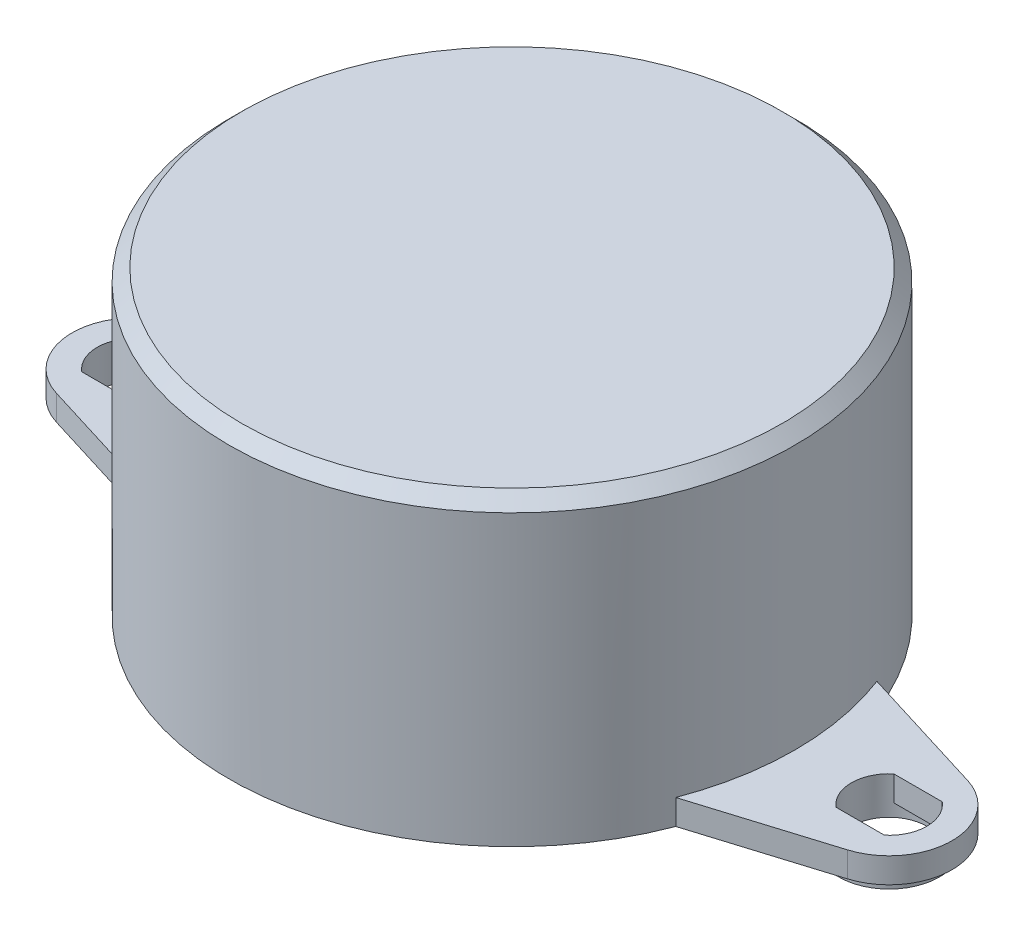
ISO-10303-21;
HEADER;
FILE_DESCRIPTION(('STEP AP214'),'2;1');
FILE_NAME('part.step','',(''),(''),'','','');
FILE_SCHEMA(('AUTOMOTIVE_DESIGN { 1 0 10303 214 1 1 1 1 }'));
ENDSEC;
DATA;
#1=APPLICATION_CONTEXT('core data for automotive mechanical design processes');
#2=APPLICATION_PROTOCOL_DEFINITION('international standard','automotive_design',2000,#1);
#3=PRODUCT_CONTEXT('',#1,'mechanical');
#4=PRODUCT('Part','Part','',(#3));
#5=PRODUCT_RELATED_PRODUCT_CATEGORY('part','',(#4));
#6=PRODUCT_DEFINITION_FORMATION('','',#4);
#7=PRODUCT_DEFINITION_CONTEXT('part definition',#1,'design');
#8=PRODUCT_DEFINITION('design','',#6,#7);
#9=PRODUCT_DEFINITION_SHAPE('','',#8);
#10=(LENGTH_UNIT() NAMED_UNIT(*) SI_UNIT(.MILLI.,.METRE.));
#11=(NAMED_UNIT(*) PLANE_ANGLE_UNIT() SI_UNIT($,.RADIAN.));
#12=(NAMED_UNIT(*) SI_UNIT($,.STERADIAN.) SOLID_ANGLE_UNIT());
#13=UNCERTAINTY_MEASURE_WITH_UNIT(LENGTH_MEASURE(1.E-05),#10,'distance_accuracy_value','');
#14=(GEOMETRIC_REPRESENTATION_CONTEXT(3) GLOBAL_UNCERTAINTY_ASSIGNED_CONTEXT((#13)) GLOBAL_UNIT_ASSIGNED_CONTEXT((#10,
#11,#12)) REPRESENTATION_CONTEXT('',''));
#15=CARTESIAN_POINT('',(0.,0.,0.));
#16=DIRECTION('',(0.,0.,1.));
#17=DIRECTION('',(1.,0.,0.));
#18=AXIS2_PLACEMENT_3D('',#15,#16,#17);
#19=CARTESIAN_POINT('',(0.,0.,0.));
#20=DIRECTION('',(0.,1.,0.));
#21=DIRECTION('',(0.,0.,1.));
#22=AXIS2_PLACEMENT_3D('',#19,#20,#21);
#23=PLANE('',#22);
#24=DIRECTION('',(1.,0.,0.));
#25=VECTOR('',#24,1.);
#26=CARTESIAN_POINT('',(-14.0369319857871,0.,-1.15));
#27=LINE('',#26,#25);
#28=CARTESIAN_POINT('',(-15.9630680142129,0.,-1.15));
#29=VERTEX_POINT('',#28);
#30=CARTESIAN_POINT('',(-14.0369319857871,0.,-1.15));
#31=VERTEX_POINT('',#30);
#32=EDGE_CURVE('E161',#29,#31,#27,.T.);
#33=ORIENTED_EDGE('',*,*,#32,.F.);
#34=CARTESIAN_POINT('',(-15.,0.,0.));
#35=DIRECTION('',(0.,-1.,0.));
#36=DIRECTION('',(0.,0.,-1.));
#37=AXIS2_PLACEMENT_3D('',#34,#35,#36);
#38=CIRCLE('',#37,1.50000000000001);
#39=EDGE_CURVE('E158',#29,#31,#38,.T.);
#40=ORIENTED_EDGE('',*,*,#39,.T.);
#41=EDGE_LOOP('',(#33,#40));
#42=FACE_BOUND('',#41,.T.);
#43=ADVANCED_FACE('F45',(#42),#23,.F.);
#44=DIRECTION('',(-1.,0.,0.));
#45=VECTOR('',#44,1.);
#46=CARTESIAN_POINT('',(-15.9630680142129,0.,1.15));
#47=LINE('',#46,#45);
#48=CARTESIAN_POINT('',(-14.0369319857871,0.,1.15));
#49=VERTEX_POINT('',#48);
#50=CARTESIAN_POINT('',(-15.9630680142129,0.,1.15));
#51=VERTEX_POINT('',#50);
#52=EDGE_CURVE('E184',#49,#51,#47,.T.);
#53=ORIENTED_EDGE('',*,*,#52,.F.);
#54=EDGE_CURVE('E165',#49,#51,#38,.T.);
#55=ORIENTED_EDGE('',*,*,#54,.T.);
#56=EDGE_LOOP('',(#53,#55));
#57=FACE_BOUND('',#56,.T.);
#58=ADVANCED_FACE('F422',(#57),#23,.F.);
#59=DIRECTION('',(-1.,0.,0.));
#60=VECTOR('',#59,1.);
#61=CARTESIAN_POINT('',(14.0369319857871,0.,1.15000000000001));
#62=LINE('',#61,#60);
#63=CARTESIAN_POINT('',(15.9630680142129,0.,1.15000000000001));
#64=VERTEX_POINT('',#63);
#65=CARTESIAN_POINT('',(14.0369319857871,0.,1.15));
#66=VERTEX_POINT('',#65);
#67=EDGE_CURVE('E193',#64,#66,#62,.T.);
#68=ORIENTED_EDGE('',*,*,#67,.F.);
#69=CARTESIAN_POINT('',(15.,0.,0.));
#70=DIRECTION('',(0.,-1.,0.));
#71=DIRECTION('',(0.,0.,-1.));
#72=AXIS2_PLACEMENT_3D('',#69,#70,#71);
#73=CIRCLE('',#72,1.50000000000001);
#74=EDGE_CURVE('E262',#64,#66,#73,.T.);
#75=ORIENTED_EDGE('',*,*,#74,.T.);
#76=EDGE_LOOP('',(#68,#75));
#77=FACE_BOUND('',#76,.T.);
#78=ADVANCED_FACE('F426',(#77),#23,.F.);
#79=DIRECTION('',(1.,0.,0.));
#80=VECTOR('',#79,1.);
#81=CARTESIAN_POINT('',(14.0369319857871,0.,-1.14999999999999));
#82=LINE('',#81,#80);
#83=CARTESIAN_POINT('',(14.0369319857871,0.,-1.15));
#84=VERTEX_POINT('',#83);
#85=CARTESIAN_POINT('',(15.9630680142129,0.,-1.15));
#86=VERTEX_POINT('',#85);
#87=EDGE_CURVE('E185',#84,#86,#82,.T.);
#88=ORIENTED_EDGE('',*,*,#87,.F.);
#89=EDGE_CURVE('E258',#84,#86,#73,.T.);
#90=ORIENTED_EDGE('',*,*,#89,.T.);
#91=EDGE_LOOP('',(#88,#90));
#92=FACE_BOUND('',#91,.T.);
#93=ADVANCED_FACE('F393',(#92),#23,.F.);
#94=CARTESIAN_POINT('',(0.,12.,0.));
#95=DIRECTION('',(0.,-1.,0.));
#96=DIRECTION('',(0.,0.,-1.));
#97=AXIS2_PLACEMENT_3D('',#94,#95,#96);
#98=CYLINDRICAL_SURFACE('',#97,11.25);
#99=CARTESIAN_POINT('',(0.,11.5,0.));
#100=DIRECTION('',(0.,1.,0.));
#101=DIRECTION('',(0.,0.,1.));
#102=AXIS2_PLACEMENT_3D('',#99,#100,#101);
#103=CIRCLE('',#102,11.25);
#104=CARTESIAN_POINT('',(0.,11.5,11.25));
#105=VERTEX_POINT('',#104);
#106=EDGE_CURVE('E255',#105,#105,#103,.F.);
#107=ORIENTED_EDGE('',*,*,#106,.T.);
#108=EDGE_LOOP('',(#107));
#109=FACE_BOUND('',#108,.T.);
#110=CARTESIAN_POINT('',(0.,1.,0.));
#111=DIRECTION('',(0.,1.,0.));
#112=DIRECTION('',(0.,0.,-1.));
#113=AXIS2_PLACEMENT_3D('',#110,#111,#112);
#114=CIRCLE('',#113,11.25);
#115=CARTESIAN_POINT('',(10.5148704224065,1.,4.));
#116=VERTEX_POINT('',#115);
#117=CARTESIAN_POINT('',(10.5148704224065,1.,-4.));
#118=VERTEX_POINT('',#117);
#119=EDGE_CURVE('E66',#116,#118,#114,.T.);
#120=ORIENTED_EDGE('',*,*,#119,.T.);
#121=DIRECTION('',(0.,-1.,0.));
#122=VECTOR('',#121,1.);
#123=CARTESIAN_POINT('',(10.5148704224065,1.,-4.));
#124=LINE('',#123,#122);
#125=CARTESIAN_POINT('',(10.5148704224065,0.,-4.));
#126=VERTEX_POINT('',#125);
#127=EDGE_CURVE('E286',#118,#126,#124,.T.);
#128=ORIENTED_EDGE('',*,*,#127,.T.);
#129=CARTESIAN_POINT('',(0.,0.,0.));
#130=DIRECTION('',(0.,1.,0.));
#131=DIRECTION('',(0.,0.,1.));
#132=AXIS2_PLACEMENT_3D('',#129,#130,#131);
#133=CIRCLE('',#132,11.25);
#134=CARTESIAN_POINT('',(-10.5148704224065,0.,-4.));
#135=VERTEX_POINT('',#134);
#136=EDGE_CURVE('E238',#126,#135,#133,.T.);
#137=ORIENTED_EDGE('',*,*,#136,.T.);
#138=DIRECTION('',(0.,-1.,0.));
#139=VECTOR('',#138,1.);
#140=CARTESIAN_POINT('',(-10.5148704224065,1.,-4.));
#141=LINE('',#140,#139);
#142=CARTESIAN_POINT('',(-10.5148704224065,1.,-4.));
#143=VERTEX_POINT('',#142);
#144=EDGE_CURVE('E243',#143,#135,#141,.T.);
#145=ORIENTED_EDGE('',*,*,#144,.F.);
#146=CARTESIAN_POINT('',(0.,1.,0.));
#147=DIRECTION('',(0.,1.,0.));
#148=DIRECTION('',(0.,0.,-1.));
#149=AXIS2_PLACEMENT_3D('',#146,#147,#148);
#150=CIRCLE('',#149,11.25);
#151=CARTESIAN_POINT('',(-10.5148704224065,1.,4.));
#152=VERTEX_POINT('',#151);
#153=EDGE_CURVE('E217',#143,#152,#150,.T.);
#154=ORIENTED_EDGE('',*,*,#153,.T.);
#155=DIRECTION('',(0.,-1.,0.));
#156=VECTOR('',#155,1.);
#157=CARTESIAN_POINT('',(-10.5148704224065,1.,4.));
#158=LINE('',#157,#156);
#159=CARTESIAN_POINT('',(-10.5148704224065,0.,4.));
#160=VERTEX_POINT('',#159);
#161=EDGE_CURVE('E239',#152,#160,#158,.T.);
#162=ORIENTED_EDGE('',*,*,#161,.T.);
#163=CARTESIAN_POINT('',(10.5148704224065,0.,4.));
#164=VERTEX_POINT('',#163);
#165=EDGE_CURVE('E249',#160,#164,#133,.T.);
#166=ORIENTED_EDGE('',*,*,#165,.T.);
#167=DIRECTION('',(0.,-1.,0.));
#168=VECTOR('',#167,1.);
#169=CARTESIAN_POINT('',(10.5148704224065,1.,4.));
#170=LINE('',#169,#168);
#171=EDGE_CURVE('E62',#116,#164,#170,.T.);
#172=ORIENTED_EDGE('',*,*,#171,.F.);
#173=EDGE_LOOP('',(#120,#128,#137,#145,#154,#162,#166,#172));
#174=FACE_BOUND('',#173,.T.);
#175=ADVANCED_FACE('F399',(#109,#174),#98,.T.);
#176=CARTESIAN_POINT('',(0.,12.,0.));
#177=DIRECTION('',(0.,1.,0.));
#178=DIRECTION('',(0.,0.,1.));
#179=AXIS2_PLACEMENT_3D('',#176,#177,#178);
#180=PLANE('',#179);
#181=CARTESIAN_POINT('',(0.,12.,0.));
#182=DIRECTION('',(0.,1.,0.));
#183=DIRECTION('',(0.,0.,1.));
#184=AXIS2_PLACEMENT_3D('',#181,#182,#183);
#185=CIRCLE('',#184,10.75);
#186=CARTESIAN_POINT('',(0.,12.,10.75));
#187=VERTEX_POINT('',#186);
#188=EDGE_CURVE('E252',#187,#187,#185,.T.);
#189=ORIENTED_EDGE('',*,*,#188,.T.);
#190=EDGE_LOOP('',(#189));
#191=FACE_BOUND('',#190,.T.);
#192=ADVANCED_FACE('F391',(#191),#180,.T.);
#193=CARTESIAN_POINT('',(-15.,0.,0.));
#194=DIRECTION('',(0.,1.,0.));
#195=DIRECTION('',(0.,0.,1.));
#196=AXIS2_PLACEMENT_3D('',#193,#194,#195);
#197=CIRCLE('',#196,2.00000000000001);
#198=CARTESIAN_POINT('',(-15.,0.,2.));
#199=VERTEX_POINT('',#198);
#200=EDGE_CURVE('E11',#199,#199,#197,.F.);
#201=ORIENTED_EDGE('',*,*,#200,.F.);
#202=EDGE_LOOP('',(#201));
#203=FACE_BOUND('',#202,.T.);
#204=CARTESIAN_POINT('',(15.,0.,0.));
#205=DIRECTION('',(0.,-1.,0.));
#206=DIRECTION('',(0.,0.,-1.));
#207=AXIS2_PLACEMENT_3D('',#204,#205,#206);
#208=CIRCLE('',#207,2.00000000000001);
#209=CARTESIAN_POINT('',(15.,0.,-2.00000000000001));
#210=VERTEX_POINT('',#209);
#211=EDGE_CURVE('E55',#210,#210,#208,.T.);
#212=ORIENTED_EDGE('',*,*,#211,.F.);
#213=EDGE_LOOP('',(#212));
#214=FACE_BOUND('',#213,.T.);
#215=ORIENTED_EDGE('',*,*,#165,.F.);
#216=DIRECTION('',(-0.95555791445854,0.,-0.294803446580338));
#217=VECTOR('',#216,1.);
#218=CARTESIAN_POINT('',(-15.7370086164509,0.,2.38889478614653));
#219=LINE('',#218,#217);
#220=CARTESIAN_POINT('',(-15.7370086164509,0.,2.38889478614653));
#221=VERTEX_POINT('',#220);
#222=EDGE_CURVE('E213',#160,#221,#219,.T.);
#223=ORIENTED_EDGE('',*,*,#222,.T.);
#224=CARTESIAN_POINT('',(-15.,0.,0.));
#225=DIRECTION('',(0.,-1.,0.));
#226=DIRECTION('',(0.,0.,-1.));
#227=AXIS2_PLACEMENT_3D('',#224,#225,#226);
#228=CIRCLE('',#227,2.50000000000019);
#229=CARTESIAN_POINT('',(-15.7370086164509,0.,-2.38889478614653));
#230=VERTEX_POINT('',#229);
#231=EDGE_CURVE('E202',#221,#230,#228,.T.);
#232=ORIENTED_EDGE('',*,*,#231,.T.);
#233=DIRECTION('',(0.95555791445854,0.,-0.294803446580338));
#234=VECTOR('',#233,1.);
#235=CARTESIAN_POINT('',(-15.7370086164509,0.,-2.38889478614653));
#236=LINE('',#235,#234);
#237=EDGE_CURVE('E228',#230,#135,#236,.T.);
#238=ORIENTED_EDGE('',*,*,#237,.T.);
#239=ORIENTED_EDGE('',*,*,#136,.F.);
#240=DIRECTION('',(0.95555791445854,0.,0.294803446580338));
#241=VECTOR('',#240,1.);
#242=CARTESIAN_POINT('',(15.7370086164509,0.,-2.38889478614653));
#243=LINE('',#242,#241);
#244=CARTESIAN_POINT('',(15.7370086164509,0.,-2.38889478614653));
#245=VERTEX_POINT('',#244);
#246=EDGE_CURVE('E291',#126,#245,#243,.T.);
#247=ORIENTED_EDGE('',*,*,#246,.T.);
#248=CARTESIAN_POINT('',(15.,0.,0.));
#249=DIRECTION('',(0.,-1.,0.));
#250=DIRECTION('',(0.,0.,-1.));
#251=AXIS2_PLACEMENT_3D('',#248,#249,#250);
#252=CIRCLE('',#251,2.50000000000019);
#253=CARTESIAN_POINT('',(15.7370086164509,0.,2.38889478614653));
#254=VERTEX_POINT('',#253);
#255=EDGE_CURVE('E300',#245,#254,#252,.T.);
#256=ORIENTED_EDGE('',*,*,#255,.T.);
#257=DIRECTION('',(-0.95555791445854,0.,0.294803446580338));
#258=VECTOR('',#257,1.);
#259=CARTESIAN_POINT('',(15.7370086164509,0.,2.38889478614653));
#260=LINE('',#259,#258);
#261=EDGE_CURVE('E295',#254,#164,#260,.T.);
#262=ORIENTED_EDGE('',*,*,#261,.T.);
#263=EDGE_LOOP('',(#215,#223,#232,#238,#239,#247,#256,#262));
#264=FACE_BOUND('',#263,.T.);
#265=ADVANCED_FACE('F388',(#203,#214,#264),#23,.F.);
#266=CARTESIAN_POINT('',(0.,12.,0.));
#267=DIRECTION('',(0.,-1.,0.));
#268=DIRECTION('',(0.,0.,-1.));
#269=AXIS2_PLACEMENT_3D('',#266,#267,#268);
#270=CONICAL_SURFACE('',#269,10.75,0.785398163397448);
#271=ORIENTED_EDGE('',*,*,#106,.F.);
#272=EDGE_LOOP('',(#271));
#273=FACE_BOUND('',#272,.T.);
#274=ORIENTED_EDGE('',*,*,#188,.F.);
#275=EDGE_LOOP('',(#274));
#276=FACE_BOUND('',#275,.T.);
#277=ADVANCED_FACE('F48',(#273,#276),#270,.T.);
#278=CARTESIAN_POINT('',(-15.,1.,0.));
#279=DIRECTION('',(0.,-1.,0.));
#280=DIRECTION('',(0.,0.,-1.));
#281=AXIS2_PLACEMENT_3D('',#278,#279,#280);
#282=CYLINDRICAL_SURFACE('',#281,2.50000000000019);
#283=ORIENTED_EDGE('',*,*,#231,.F.);
#284=DIRECTION('',(0.,-1.,0.));
#285=VECTOR('',#284,1.);
#286=CARTESIAN_POINT('',(-15.7370086164509,1.,2.38889478614653));
#287=LINE('',#286,#285);
#288=CARTESIAN_POINT('',(-15.7370086164509,1.,2.38889478614653));
#289=VERTEX_POINT('',#288);
#290=EDGE_CURVE('E235',#289,#221,#287,.T.);
#291=ORIENTED_EDGE('',*,*,#290,.F.);
#292=CARTESIAN_POINT('',(-15.,1.,0.));
#293=DIRECTION('',(0.,-1.,0.));
#294=DIRECTION('',(0.,0.,-1.));
#295=AXIS2_PLACEMENT_3D('',#292,#293,#294);
#296=CIRCLE('',#295,2.50000000000019);
#297=CARTESIAN_POINT('',(-15.7370086164509,1.,-2.38889478614653));
#298=VERTEX_POINT('',#297);
#299=EDGE_CURVE('E208',#289,#298,#296,.T.);
#300=ORIENTED_EDGE('',*,*,#299,.T.);
#301=DIRECTION('',(0.,-1.,0.));
#302=VECTOR('',#301,1.);
#303=CARTESIAN_POINT('',(-15.7370086164509,1.,-2.38889478614653));
#304=LINE('',#303,#302);
#305=EDGE_CURVE('E224',#298,#230,#304,.T.);
#306=ORIENTED_EDGE('',*,*,#305,.T.);
#307=EDGE_LOOP('',(#283,#291,#300,#306));
#308=FACE_BOUND('',#307,.T.);
#309=ADVANCED_FACE('F407',(#308),#282,.T.);
#310=CARTESIAN_POINT('',(-15.7370086164509,1.,2.38889478614653));
#311=DIRECTION('',(-0.294803446580338,0.,0.95555791445854));
#312=DIRECTION('',(0.95555791445854,0.,0.294803446580338));
#313=AXIS2_PLACEMENT_3D('',#310,#311,#312);
#314=PLANE('',#313);
#315=ORIENTED_EDGE('',*,*,#222,.F.);
#316=ORIENTED_EDGE('',*,*,#161,.F.);
#317=DIRECTION('',(-0.95555791445854,0.,-0.294803446580338));
#318=VECTOR('',#317,1.);
#319=CARTESIAN_POINT('',(-15.7370086164509,1.,2.38889478614653));
#320=LINE('',#319,#318);
#321=EDGE_CURVE('E220',#152,#289,#320,.T.);
#322=ORIENTED_EDGE('',*,*,#321,.T.);
#323=ORIENTED_EDGE('',*,*,#290,.T.);
#324=EDGE_LOOP('',(#315,#316,#322,#323));
#325=FACE_BOUND('',#324,.T.);
#326=ADVANCED_FACE('F403',(#325),#314,.T.);
#327=CARTESIAN_POINT('',(-15.7370086164509,1.,-2.38889478614653));
#328=DIRECTION('',(-0.294803446580338,0.,-0.95555791445854));
#329=DIRECTION('',(-0.95555791445854,0.,0.294803446580338));
#330=AXIS2_PLACEMENT_3D('',#327,#328,#329);
#331=PLANE('',#330);
#332=ORIENTED_EDGE('',*,*,#237,.F.);
#333=ORIENTED_EDGE('',*,*,#305,.F.);
#334=DIRECTION('',(0.95555791445854,0.,-0.294803446580338));
#335=VECTOR('',#334,1.);
#336=CARTESIAN_POINT('',(-15.7370086164509,1.,-2.38889478614653));
#337=LINE('',#336,#335);
#338=EDGE_CURVE('E212',#298,#143,#337,.T.);
#339=ORIENTED_EDGE('',*,*,#338,.T.);
#340=ORIENTED_EDGE('',*,*,#144,.T.);
#341=EDGE_LOOP('',(#332,#333,#339,#340));
#342=FACE_BOUND('',#341,.T.);
#343=ADVANCED_FACE('F410',(#342),#331,.T.);
#344=CARTESIAN_POINT('',(-15.,1.,0.));
#345=DIRECTION('',(0.,-1.,0.));
#346=DIRECTION('',(0.,0.,-1.));
#347=AXIS2_PLACEMENT_3D('',#344,#345,#346);
#348=PLANE('',#347);
#349=DIRECTION('',(-1.,0.,0.));
#350=VECTOR('',#349,1.);
#351=CARTESIAN_POINT('',(-15.9630680142129,1.,1.15));
#352=LINE('',#351,#350);
#353=CARTESIAN_POINT('',(-14.0369319857871,1.,1.15));
#354=VERTEX_POINT('',#353);
#355=CARTESIAN_POINT('',(-15.9630680142129,1.,1.15));
#356=VERTEX_POINT('',#355);
#357=EDGE_CURVE('E196',#354,#356,#352,.T.);
#358=ORIENTED_EDGE('',*,*,#357,.T.);
#359=CARTESIAN_POINT('',(-15.,1.,0.));
#360=DIRECTION('',(0.,-1.,0.));
#361=DIRECTION('',(0.,0.,-1.));
#362=AXIS2_PLACEMENT_3D('',#359,#360,#361);
#363=CIRCLE('',#362,1.5);
#364=CARTESIAN_POINT('',(-15.9630680142129,1.,-1.15));
#365=VERTEX_POINT('',#364);
#366=EDGE_CURVE('E190',#356,#365,#363,.T.);
#367=ORIENTED_EDGE('',*,*,#366,.T.);
#368=DIRECTION('',(1.,0.,0.));
#369=VECTOR('',#368,1.);
#370=CARTESIAN_POINT('',(-14.0369319857871,1.,-1.15));
#371=LINE('',#370,#369);
#372=CARTESIAN_POINT('',(-14.0369319857871,1.,-1.15));
#373=VERTEX_POINT('',#372);
#374=EDGE_CURVE('E353',#365,#373,#371,.T.);
#375=ORIENTED_EDGE('',*,*,#374,.T.);
#376=CARTESIAN_POINT('',(-15.,1.,0.));
#377=DIRECTION('',(0.,-1.,0.));
#378=DIRECTION('',(0.,0.,-1.));
#379=AXIS2_PLACEMENT_3D('',#376,#377,#378);
#380=CIRCLE('',#379,1.5);
#381=EDGE_CURVE('E174',#373,#354,#380,.T.);
#382=ORIENTED_EDGE('',*,*,#381,.T.);
#383=EDGE_LOOP('',(#358,#367,#375,#382));
#384=FACE_BOUND('',#383,.T.);
#385=ORIENTED_EDGE('',*,*,#299,.F.);
#386=ORIENTED_EDGE('',*,*,#321,.F.);
#387=ORIENTED_EDGE('',*,*,#153,.F.);
#388=ORIENTED_EDGE('',*,*,#338,.F.);
#389=EDGE_LOOP('',(#385,#386,#387,#388));
#390=FACE_BOUND('',#389,.T.);
#391=ADVANCED_FACE('F360',(#384,#390),#348,.F.);
#392=CARTESIAN_POINT('',(-15.,1.,0.));
#393=DIRECTION('',(0.,-1.,0.));
#394=DIRECTION('',(0.,0.,-1.));
#395=AXIS2_PLACEMENT_3D('',#392,#393,#394);
#396=CYLINDRICAL_SURFACE('',#395,1.5);
#397=DIRECTION('',(0.,-1.,0.));
#398=VECTOR('',#397,1.);
#399=CARTESIAN_POINT('',(-15.9630680142129,1.,1.15));
#400=LINE('',#399,#398);
#401=EDGE_CURVE('E199',#356,#51,#400,.T.);
#402=ORIENTED_EDGE('',*,*,#401,.T.);
#403=ORIENTED_EDGE('',*,*,#54,.F.);
#404=DIRECTION('',(0.,-1.,0.));
#405=VECTOR('',#404,1.);
#406=CARTESIAN_POINT('',(-14.0369319857871,1.,1.15));
#407=LINE('',#406,#405);
#408=EDGE_CURVE('E179',#354,#49,#407,.T.);
#409=ORIENTED_EDGE('',*,*,#408,.F.);
#410=ORIENTED_EDGE('',*,*,#381,.F.);
#411=DIRECTION('',(0.,-1.,0.));
#412=VECTOR('',#411,1.);
#413=CARTESIAN_POINT('',(-14.0369319857871,1.,-1.15));
#414=LINE('',#413,#412);
#415=EDGE_CURVE('E169',#373,#31,#414,.T.);
#416=ORIENTED_EDGE('',*,*,#415,.T.);
#417=ORIENTED_EDGE('',*,*,#39,.F.);
#418=DIRECTION('',(0.,-1.,0.));
#419=VECTOR('',#418,1.);
#420=CARTESIAN_POINT('',(-15.9630680142129,1.,-1.15));
#421=LINE('',#420,#419);
#422=EDGE_CURVE('E180',#365,#29,#421,.T.);
#423=ORIENTED_EDGE('',*,*,#422,.F.);
#424=ORIENTED_EDGE('',*,*,#366,.F.);
#425=EDGE_LOOP('',(#402,#403,#409,#410,#416,#417,#423,#424));
#426=FACE_BOUND('',#425,.T.);
#427=CARTESIAN_POINT('',(-15.,-0.5,0.));
#428=DIRECTION('',(0.,-1.,0.));
#429=DIRECTION('',(0.,0.,-1.));
#430=AXIS2_PLACEMENT_3D('',#427,#428,#429);
#431=CIRCLE('',#430,1.50000000000001);
#432=CARTESIAN_POINT('',(-15.,-0.5,-1.50000000000001));
#433=VERTEX_POINT('',#432);
#434=EDGE_CURVE('E166',#433,#433,#431,.T.);
#435=ORIENTED_EDGE('',*,*,#434,.T.);
#436=EDGE_LOOP('',(#435));
#437=FACE_BOUND('',#436,.T.);
#438=ADVANCED_FACE('F171',(#426,#437),#396,.F.);
#439=CARTESIAN_POINT('',(-15.9630680142129,1.,1.15));
#440=DIRECTION('',(0.,0.,1.));
#441=DIRECTION('',(1.,0.,0.));
#442=AXIS2_PLACEMENT_3D('',#439,#440,#441);
#443=PLANE('',#442);
#444=ORIENTED_EDGE('',*,*,#52,.T.);
#445=ORIENTED_EDGE('',*,*,#401,.F.);
#446=ORIENTED_EDGE('',*,*,#357,.F.);
#447=ORIENTED_EDGE('',*,*,#408,.T.);
#448=EDGE_LOOP('',(#444,#445,#446,#447));
#449=FACE_BOUND('',#448,.T.);
#450=ADVANCED_FACE('F364',(#449),#443,.F.);
#451=CARTESIAN_POINT('',(-14.0369319857871,1.,-1.15));
#452=DIRECTION('',(0.,0.,-1.));
#453=DIRECTION('',(-1.,0.,0.));
#454=AXIS2_PLACEMENT_3D('',#451,#452,#453);
#455=PLANE('',#454);
#456=ORIENTED_EDGE('',*,*,#32,.T.);
#457=ORIENTED_EDGE('',*,*,#415,.F.);
#458=ORIENTED_EDGE('',*,*,#374,.F.);
#459=ORIENTED_EDGE('',*,*,#422,.T.);
#460=EDGE_LOOP('',(#456,#457,#458,#459));
#461=FACE_BOUND('',#460,.T.);
#462=ADVANCED_FACE('F182',(#461),#455,.F.);
#463=CARTESIAN_POINT('',(15.,1.,0.));
#464=DIRECTION('',(0.,-1.,0.));
#465=DIRECTION('',(0.,0.,-1.));
#466=AXIS2_PLACEMENT_3D('',#463,#464,#465);
#467=CYLINDRICAL_SURFACE('',#466,2.50000000000019);
#468=ORIENTED_EDGE('',*,*,#255,.F.);
#469=DIRECTION('',(0.,-1.,0.));
#470=VECTOR('',#469,1.);
#471=CARTESIAN_POINT('',(15.7370086164509,1.,-2.38889478614653));
#472=LINE('',#471,#470);
#473=CARTESIAN_POINT('',(15.7370086164509,1.,-2.38889478614653));
#474=VERTEX_POINT('',#473);
#475=EDGE_CURVE('E276',#474,#245,#472,.T.);
#476=ORIENTED_EDGE('',*,*,#475,.F.);
#477=CARTESIAN_POINT('',(15.,1.,0.));
#478=DIRECTION('',(0.,-1.,0.));
#479=DIRECTION('',(0.,0.,-1.));
#480=AXIS2_PLACEMENT_3D('',#477,#478,#479);
#481=CIRCLE('',#480,2.50000000000019);
#482=CARTESIAN_POINT('',(15.7370086164509,1.,2.38889478614653));
#483=VERTEX_POINT('',#482);
#484=EDGE_CURVE('E296',#474,#483,#481,.T.);
#485=ORIENTED_EDGE('',*,*,#484,.T.);
#486=DIRECTION('',(0.,-1.,0.));
#487=VECTOR('',#486,1.);
#488=CARTESIAN_POINT('',(15.7370086164509,1.,2.38889478614653));
#489=LINE('',#488,#487);
#490=EDGE_CURVE('E280',#483,#254,#489,.T.);
#491=ORIENTED_EDGE('',*,*,#490,.T.);
#492=EDGE_LOOP('',(#468,#476,#485,#491));
#493=FACE_BOUND('',#492,.T.);
#494=ADVANCED_FACE('F467',(#493),#467,.T.);
#495=CARTESIAN_POINT('',(15.7370086164509,1.,-2.38889478614653));
#496=DIRECTION('',(0.294803446580338,0.,-0.95555791445854));
#497=DIRECTION('',(-0.95555791445854,0.,-0.294803446580338));
#498=AXIS2_PLACEMENT_3D('',#495,#496,#497);
#499=PLANE('',#498);
#500=ORIENTED_EDGE('',*,*,#246,.F.);
#501=ORIENTED_EDGE('',*,*,#127,.F.);
#502=DIRECTION('',(0.95555791445854,0.,0.294803446580338));
#503=VECTOR('',#502,1.);
#504=CARTESIAN_POINT('',(15.7370086164509,1.,-2.38889478614653));
#505=LINE('',#504,#503);
#506=EDGE_CURVE('E283',#118,#474,#505,.T.);
#507=ORIENTED_EDGE('',*,*,#506,.T.);
#508=ORIENTED_EDGE('',*,*,#475,.T.);
#509=EDGE_LOOP('',(#500,#501,#507,#508));
#510=FACE_BOUND('',#509,.T.);
#511=ADVANCED_FACE('F471',(#510),#499,.T.);
#512=CARTESIAN_POINT('',(15.7370086164509,1.,2.38889478614653));
#513=DIRECTION('',(0.294803446580338,0.,0.95555791445854));
#514=DIRECTION('',(0.95555791445854,0.,-0.294803446580338));
#515=AXIS2_PLACEMENT_3D('',#512,#513,#514);
#516=PLANE('',#515);
#517=ORIENTED_EDGE('',*,*,#261,.F.);
#518=ORIENTED_EDGE('',*,*,#490,.F.);
#519=DIRECTION('',(-0.95555791445854,0.,0.294803446580338));
#520=VECTOR('',#519,1.);
#521=CARTESIAN_POINT('',(15.7370086164509,1.,2.38889478614653));
#522=LINE('',#521,#520);
#523=EDGE_CURVE('E310',#483,#116,#522,.T.);
#524=ORIENTED_EDGE('',*,*,#523,.T.);
#525=ORIENTED_EDGE('',*,*,#171,.T.);
#526=EDGE_LOOP('',(#517,#518,#524,#525));
#527=FACE_BOUND('',#526,.T.);
#528=ADVANCED_FACE('F477',(#527),#516,.T.);
#529=CARTESIAN_POINT('',(15.,1.,0.));
#530=DIRECTION('',(0.,-1.,0.));
#531=DIRECTION('',(0.,0.,-1.));
#532=AXIS2_PLACEMENT_3D('',#529,#530,#531);
#533=PLANE('',#532);
#534=DIRECTION('',(-1.,0.,0.));
#535=VECTOR('',#534,1.);
#536=CARTESIAN_POINT('',(14.0369319857871,1.,1.15000000000001));
#537=LINE('',#536,#535);
#538=CARTESIAN_POINT('',(15.9630680142129,1.,1.15000000000001));
#539=VERTEX_POINT('',#538);
#540=CARTESIAN_POINT('',(14.0369319857871,1.,1.15000000000001));
#541=VERTEX_POINT('',#540);
#542=EDGE_CURVE('E321',#539,#541,#537,.T.);
#543=ORIENTED_EDGE('',*,*,#542,.T.);
#544=CARTESIAN_POINT('',(15.,1.,0.));
#545=DIRECTION('',(0.,-1.,0.));
#546=DIRECTION('',(0.,0.,-1.));
#547=AXIS2_PLACEMENT_3D('',#544,#545,#546);
#548=CIRCLE('',#547,1.5);
#549=CARTESIAN_POINT('',(14.0369319857871,1.,-1.14999999999999));
#550=VERTEX_POINT('',#549);
#551=EDGE_CURVE('E334',#541,#550,#548,.T.);
#552=ORIENTED_EDGE('',*,*,#551,.T.);
#553=DIRECTION('',(1.,0.,0.));
#554=VECTOR('',#553,1.);
#555=CARTESIAN_POINT('',(14.0369319857871,1.,-1.14999999999999));
#556=LINE('',#555,#554);
#557=CARTESIAN_POINT('',(15.9630680142129,1.,-1.14999999999999));
#558=VERTEX_POINT('',#557);
#559=EDGE_CURVE('E343',#550,#558,#556,.T.);
#560=ORIENTED_EDGE('',*,*,#559,.T.);
#561=CARTESIAN_POINT('',(15.,1.,0.));
#562=DIRECTION('',(0.,-1.,0.));
#563=DIRECTION('',(0.,0.,-1.));
#564=AXIS2_PLACEMENT_3D('',#561,#562,#563);
#565=CIRCLE('',#564,1.5);
#566=EDGE_CURVE('E339',#558,#539,#565,.T.);
#567=ORIENTED_EDGE('',*,*,#566,.T.);
#568=EDGE_LOOP('',(#543,#552,#560,#567));
#569=FACE_BOUND('',#568,.T.);
#570=ORIENTED_EDGE('',*,*,#484,.F.);
#571=ORIENTED_EDGE('',*,*,#506,.F.);
#572=ORIENTED_EDGE('',*,*,#119,.F.);
#573=ORIENTED_EDGE('',*,*,#523,.F.);
#574=EDGE_LOOP('',(#570,#571,#572,#573));
#575=FACE_BOUND('',#574,.T.);
#576=ADVANCED_FACE('F449',(#569,#575),#533,.F.);
#577=CARTESIAN_POINT('',(15.,1.,0.));
#578=DIRECTION('',(0.,-1.,0.));
#579=DIRECTION('',(0.,0.,-1.));
#580=AXIS2_PLACEMENT_3D('',#577,#578,#579);
#581=CYLINDRICAL_SURFACE('',#580,1.5);
#582=DIRECTION('',(0.,-1.,0.));
#583=VECTOR('',#582,1.);
#584=CARTESIAN_POINT('',(14.0369319857871,1.,1.15000000000001));
#585=LINE('',#584,#583);
#586=EDGE_CURVE('E304',#541,#66,#585,.T.);
#587=ORIENTED_EDGE('',*,*,#586,.T.);
#588=ORIENTED_EDGE('',*,*,#74,.F.);
#589=DIRECTION('',(0.,-1.,0.));
#590=VECTOR('',#589,1.);
#591=CARTESIAN_POINT('',(15.9630680142129,1.,1.15000000000001));
#592=LINE('',#591,#590);
#593=EDGE_CURVE('E325',#539,#64,#592,.T.);
#594=ORIENTED_EDGE('',*,*,#593,.F.);
#595=ORIENTED_EDGE('',*,*,#566,.F.);
#596=DIRECTION('',(0.,-1.,0.));
#597=VECTOR('',#596,1.);
#598=CARTESIAN_POINT('',(15.9630680142129,1.,-1.15));
#599=LINE('',#598,#597);
#600=EDGE_CURVE('E322',#558,#86,#599,.T.);
#601=ORIENTED_EDGE('',*,*,#600,.T.);
#602=ORIENTED_EDGE('',*,*,#89,.F.);
#603=DIRECTION('',(0.,-1.,0.));
#604=VECTOR('',#603,1.);
#605=CARTESIAN_POINT('',(14.0369319857871,1.,-1.14999999999999));
#606=LINE('',#605,#604);
#607=EDGE_CURVE('E317',#550,#84,#606,.T.);
#608=ORIENTED_EDGE('',*,*,#607,.F.);
#609=ORIENTED_EDGE('',*,*,#551,.F.);
#610=EDGE_LOOP('',(#587,#588,#594,#595,#601,#602,#608,#609));
#611=FACE_BOUND('',#610,.T.);
#612=CARTESIAN_POINT('',(15.,-0.5,0.));
#613=DIRECTION('',(0.,-1.,0.));
#614=DIRECTION('',(0.,0.,-1.));
#615=AXIS2_PLACEMENT_3D('',#612,#613,#614);
#616=CIRCLE('',#615,1.50000000000001);
#617=CARTESIAN_POINT('',(15.,-0.5,-1.50000000000001));
#618=VERTEX_POINT('',#617);
#619=EDGE_CURVE('E270',#618,#618,#616,.T.);
#620=ORIENTED_EDGE('',*,*,#619,.T.);
#621=EDGE_LOOP('',(#620));
#622=FACE_BOUND('',#621,.T.);
#623=ADVANCED_FACE('F445',(#611,#622),#581,.F.);
#624=CARTESIAN_POINT('',(14.0369319857871,1.,1.15000000000001));
#625=DIRECTION('',(0.,0.,1.));
#626=DIRECTION('',(1.,0.,0.));
#627=AXIS2_PLACEMENT_3D('',#624,#625,#626);
#628=PLANE('',#627);
#629=ORIENTED_EDGE('',*,*,#67,.T.);
#630=ORIENTED_EDGE('',*,*,#586,.F.);
#631=ORIENTED_EDGE('',*,*,#542,.F.);
#632=ORIENTED_EDGE('',*,*,#593,.T.);
#633=EDGE_LOOP('',(#629,#630,#631,#632));
#634=FACE_BOUND('',#633,.T.);
#635=ADVANCED_FACE('F452',(#634),#628,.F.);
#636=CARTESIAN_POINT('',(14.0369319857871,1.,-1.14999999999999));
#637=DIRECTION('',(0.,0.,-1.));
#638=DIRECTION('',(-1.,0.,0.));
#639=AXIS2_PLACEMENT_3D('',#636,#637,#638);
#640=PLANE('',#639);
#641=ORIENTED_EDGE('',*,*,#87,.T.);
#642=ORIENTED_EDGE('',*,*,#600,.F.);
#643=ORIENTED_EDGE('',*,*,#559,.F.);
#644=ORIENTED_EDGE('',*,*,#607,.T.);
#645=EDGE_LOOP('',(#641,#642,#643,#644));
#646=FACE_BOUND('',#645,.T.);
#647=ADVANCED_FACE('F441',(#646),#640,.F.);
#648=CARTESIAN_POINT('',(15.,-0.5,0.));
#649=DIRECTION('',(0.,-1.,0.));
#650=DIRECTION('',(0.,0.,-1.));
#651=AXIS2_PLACEMENT_3D('',#648,#649,#650);
#652=PLANE('',#651);
#653=CARTESIAN_POINT('',(15.,-0.5,0.));
#654=DIRECTION('',(0.,-1.,0.));
#655=DIRECTION('',(0.,0.,-1.));
#656=AXIS2_PLACEMENT_3D('',#653,#654,#655);
#657=CIRCLE('',#656,2.00000000000001);
#658=CARTESIAN_POINT('',(15.,-0.5,-2.00000000000001));
#659=VERTEX_POINT('',#658);
#660=EDGE_CURVE('E272',#659,#659,#657,.T.);
#661=ORIENTED_EDGE('',*,*,#660,.T.);
#662=EDGE_LOOP('',(#661));
#663=FACE_BOUND('',#662,.T.);
#664=ORIENTED_EDGE('',*,*,#619,.F.);
#665=EDGE_LOOP('',(#664));
#666=FACE_BOUND('',#665,.T.);
#667=ADVANCED_FACE('F460',(#663,#666),#652,.T.);
#668=CARTESIAN_POINT('',(15.,-0.5,0.));
#669=DIRECTION('',(0.,1.,0.));
#670=DIRECTION('',(0.,0.,1.));
#671=AXIS2_PLACEMENT_3D('',#668,#669,#670);
#672=CYLINDRICAL_SURFACE('',#671,2.00000000000001);
#673=ORIENTED_EDGE('',*,*,#660,.F.);
#674=EDGE_LOOP('',(#673));
#675=FACE_BOUND('',#674,.T.);
#676=ORIENTED_EDGE('',*,*,#211,.T.);
#677=EDGE_LOOP('',(#676));
#678=FACE_BOUND('',#677,.T.);
#679=ADVANCED_FACE('F483',(#675,#678),#672,.T.);
#680=CARTESIAN_POINT('',(-15.,-0.5,0.));
#681=DIRECTION('',(0.,-1.,0.));
#682=DIRECTION('',(0.,0.,-1.));
#683=AXIS2_PLACEMENT_3D('',#680,#681,#682);
#684=PLANE('',#683);
#685=CARTESIAN_POINT('',(-15.,-0.5,0.));
#686=DIRECTION('',(0.,-1.,0.));
#687=DIRECTION('',(0.,0.,-1.));
#688=AXIS2_PLACEMENT_3D('',#685,#686,#687);
#689=CIRCLE('',#688,2.00000000000001);
#690=CARTESIAN_POINT('',(-15.,-0.5,-2.00000000000001));
#691=VERTEX_POINT('',#690);
#692=EDGE_CURVE('E371',#691,#691,#689,.T.);
#693=ORIENTED_EDGE('',*,*,#692,.T.);
#694=EDGE_LOOP('',(#693));
#695=FACE_BOUND('',#694,.T.);
#696=ORIENTED_EDGE('',*,*,#434,.F.);
#697=EDGE_LOOP('',(#696));
#698=FACE_BOUND('',#697,.T.);
#699=ADVANCED_FACE('F379',(#695,#698),#684,.T.);
#700=CARTESIAN_POINT('',(-15.,-0.5,0.));
#701=DIRECTION('',(0.,1.,0.));
#702=DIRECTION('',(0.,0.,1.));
#703=AXIS2_PLACEMENT_3D('',#700,#701,#702);
#704=CYLINDRICAL_SURFACE('',#703,2.00000000000001);
#705=ORIENTED_EDGE('',*,*,#692,.F.);
#706=EDGE_LOOP('',(#705));
#707=FACE_BOUND('',#706,.T.);
#708=ORIENTED_EDGE('',*,*,#200,.T.);
#709=EDGE_LOOP('',(#708));
#710=FACE_BOUND('',#709,.T.);
#711=ADVANCED_FACE('F382',(#707,#710),#704,.T.);
#712=CLOSED_SHELL('',(#43,#58,#78,#93,#175,#192,#265,#277,#309,#326,#343,#391,#438,#450,#462,
#494,#511,#528,#576,#623,#635,#647,#667,#679,#699,#711));
#713=MANIFOLD_SOLID_BREP('B2',#712);
#714=ADVANCED_BREP_SHAPE_REPRESENTATION('',(#18,#713),#14);
#715=SHAPE_DEFINITION_REPRESENTATION(#9,#714);
ENDSEC;
END-ISO-10303-21;
